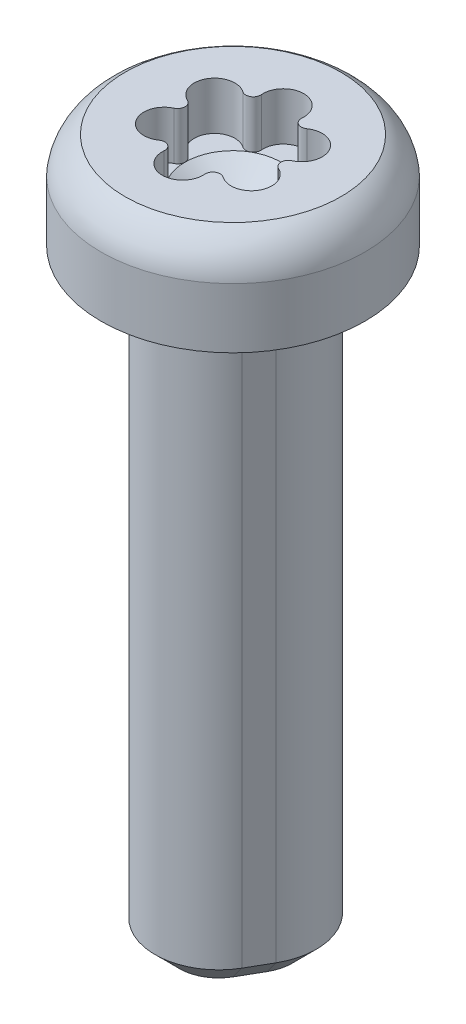
ISO-10303-21;
HEADER;
FILE_DESCRIPTION(('STEP AP214'),'2;1');
FILE_NAME('part.step','',(''),(''),'','','');
FILE_SCHEMA(('AUTOMOTIVE_DESIGN { 1 0 10303 214 1 1 1 1 }'));
ENDSEC;
DATA;
#1=APPLICATION_CONTEXT('core data for automotive mechanical design processes');
#2=APPLICATION_PROTOCOL_DEFINITION('international standard','automotive_design',2000,#1);
#3=PRODUCT_CONTEXT('',#1,'mechanical');
#4=PRODUCT('Part','Part','',(#3));
#5=PRODUCT_RELATED_PRODUCT_CATEGORY('part','',(#4));
#6=PRODUCT_DEFINITION_FORMATION('','',#4);
#7=PRODUCT_DEFINITION_CONTEXT('part definition',#1,'design');
#8=PRODUCT_DEFINITION('design','',#6,#7);
#9=PRODUCT_DEFINITION_SHAPE('','',#8);
#10=(LENGTH_UNIT() NAMED_UNIT(*) SI_UNIT(.MILLI.,.METRE.));
#11=(NAMED_UNIT(*) PLANE_ANGLE_UNIT() SI_UNIT($,.RADIAN.));
#12=(NAMED_UNIT(*) SI_UNIT($,.STERADIAN.) SOLID_ANGLE_UNIT());
#13=UNCERTAINTY_MEASURE_WITH_UNIT(LENGTH_MEASURE(1.E-05),#10,'distance_accuracy_value','');
#14=(GEOMETRIC_REPRESENTATION_CONTEXT(3) GLOBAL_UNCERTAINTY_ASSIGNED_CONTEXT((#13)) GLOBAL_UNIT_ASSIGNED_CONTEXT((#10,
#11,#12)) REPRESENTATION_CONTEXT('',''));
#15=CARTESIAN_POINT('',(0.,0.,0.));
#16=DIRECTION('',(0.,0.,1.));
#17=DIRECTION('',(1.,0.,0.));
#18=AXIS2_PLACEMENT_3D('',#15,#16,#17);
#19=CARTESIAN_POINT('',(0.,0.,0.));
#20=DIRECTION('',(0.,1.,0.));
#21=DIRECTION('',(0.,0.,1.));
#22=AXIS2_PLACEMENT_3D('',#19,#20,#21);
#23=CONICAL_SURFACE('',#22,0.507999999967979,1.02974425862593);
#24=CARTESIAN_POINT('',(0.,-0.305237194481833,0.));
#25=VERTEX_POINT('',#24);
#26=VERTEX_LOOP('',#25);
#27=FACE_BOUND('',#26,.T.);
#28=CARTESIAN_POINT('',(0.,0.,0.));
#29=DIRECTION('',(0.,1.,0.));
#30=DIRECTION('',(0.,0.,1.));
#31=AXIS2_PLACEMENT_3D('',#28,#29,#30);
#32=CIRCLE('',#31,0.507999999967979);
#33=CARTESIAN_POINT('',(0.507999999983995,0.,0.));
#34=VERTEX_POINT('',#33);
#35=CARTESIAN_POINT('',(0.253999999991877,0.,0.439940905108728));
#36=VERTEX_POINT('',#35);
#37=EDGE_CURVE('E201',#34,#36,#32,.F.);
#38=ORIENTED_EDGE('',*,*,#37,.F.);
#39=CARTESIAN_POINT('',(0.,0.,0.));
#40=DIRECTION('',(0.,1.,0.));
#41=DIRECTION('',(0.,0.,1.));
#42=AXIS2_PLACEMENT_3D('',#39,#40,#41);
#43=CIRCLE('',#42,0.507999999967979);
#44=CARTESIAN_POINT('',(0.253999999992017,0.,-0.439940905108593));
#45=VERTEX_POINT('',#44);
#46=EDGE_CURVE('E227',#45,#34,#43,.F.);
#47=ORIENTED_EDGE('',*,*,#46,.F.);
#48=CARTESIAN_POINT('',(0.,0.,0.));
#49=DIRECTION('',(0.,1.,0.));
#50=DIRECTION('',(0.,0.,1.));
#51=AXIS2_PLACEMENT_3D('',#48,#49,#50);
#52=CIRCLE('',#51,0.507999999967979);
#53=CARTESIAN_POINT('',(-0.253999999991996,0.,-0.439940905108543));
#54=VERTEX_POINT('',#53);
#55=EDGE_CURVE('E224',#54,#45,#52,.F.);
#56=ORIENTED_EDGE('',*,*,#55,.F.);
#57=CARTESIAN_POINT('',(0.,0.,0.));
#58=DIRECTION('',(0.,1.,0.));
#59=DIRECTION('',(0.,0.,1.));
#60=AXIS2_PLACEMENT_3D('',#57,#58,#59);
#61=CIRCLE('',#60,0.507999999967979);
#62=CARTESIAN_POINT('',(-0.507999999983968,0.,1.08311057522258E-13));
#63=VERTEX_POINT('',#62);
#64=EDGE_CURVE('E178',#63,#54,#61,.F.);
#65=ORIENTED_EDGE('',*,*,#64,.F.);
#66=CARTESIAN_POINT('',(0.,0.,0.));
#67=DIRECTION('',(0.,1.,0.));
#68=DIRECTION('',(0.,0.,1.));
#69=AXIS2_PLACEMENT_3D('',#66,#67,#68);
#70=CIRCLE('',#69,0.507999999967979);
#71=CARTESIAN_POINT('',(-0.253999999992049,0.,0.439940905108703));
#72=VERTEX_POINT('',#71);
#73=EDGE_CURVE('E20',#72,#63,#70,.F.);
#74=ORIENTED_EDGE('',*,*,#73,.F.);
#75=CARTESIAN_POINT('',(0.,0.,0.));
#76=DIRECTION('',(0.,1.,0.));
#77=DIRECTION('',(0.,0.,1.));
#78=AXIS2_PLACEMENT_3D('',#75,#76,#77);
#79=CIRCLE('',#78,0.507999999967979);
#80=EDGE_CURVE('E175',#36,#72,#79,.F.);
#81=ORIENTED_EDGE('',*,*,#80,.F.);
#82=EDGE_LOOP('',(#38,#47,#56,#65,#74,#81));
#83=FACE_BOUND('',#82,.T.);
#84=ADVANCED_FACE('F17',(#27,#83),#23,.F.);
#85=CARTESIAN_POINT('',(-0.146605300490876,0.,-0.52062782910893));
#86=DIRECTION('',(0.,1.,0.));
#87=DIRECTION('',(-1.,0.,0.));
#88=AXIS2_PLACEMENT_3D('',#85,#86,#87);
#89=PLANE('',#88);
#90=CARTESIAN_POINT('',(-0.461937950378704,0.,0.266700000000165));
#91=DIRECTION('',(0.,1.,0.));
#92=DIRECTION('',(0.,0.,1.));
#93=AXIS2_PLACEMENT_3D('',#90,#91,#92);
#94=CIRCLE('',#93,0.215900000000007);
#95=CARTESIAN_POINT('',(-0.553252928157463,0.,0.0710615967321891));
#96=VERTEX_POINT('',#95);
#97=CARTESIAN_POINT('',(-0.33816761208222,0.,0.443600292136642));
#98=VERTEX_POINT('',#97);
#99=EDGE_CURVE('E186',#96,#98,#94,.T.);
#100=ORIENTED_EDGE('',*,*,#99,.T.);
#101=CARTESIAN_POINT('',(-0.293210600981711,0.,0.50785565821811));
#102=DIRECTION('',(0.,1.,0.));
#103=DIRECTION('',(0.,0.,1.));
#104=AXIS2_PLACEMENT_3D('',#101,#102,#103);
#105=CIRCLE('',#104,0.0784212019632242);
#106=EDGE_CURVE('E184',#72,#98,#105,.T.);
#107=ORIENTED_EDGE('',*,*,#106,.F.);
#108=ORIENTED_EDGE('',*,*,#73,.T.);
#109=CARTESIAN_POINT('',(-0.586421201963182,0.,2.22044604925031E-13));
#110=DIRECTION('',(0.,1.,0.));
#111=DIRECTION('',(0.,0.,1.));
#112=AXIS2_PLACEMENT_3D('',#109,#110,#111);
#113=CIRCLE('',#112,0.0784212019632242);
#114=EDGE_CURVE('E215',#96,#63,#113,.T.);
#115=ORIENTED_EDGE('',*,*,#114,.F.);
#116=EDGE_LOOP('',(#100,#107,#108,#115));
#117=FACE_BOUND('',#116,.T.);
#118=ADVANCED_FACE('F185',(#117),#89,.T.);
#119=CARTESIAN_POINT('',(-0.146605300490876,0.,-0.52062782910893));
#120=DIRECTION('',(0.,1.,0.));
#121=DIRECTION('',(-1.,0.,0.));
#122=AXIS2_PLACEMENT_3D('',#119,#120,#121);
#123=PLANE('',#122);
#124=CARTESIAN_POINT('',(0.,0.,0.533400000000177));
#125=DIRECTION('',(0.,1.,0.));
#126=DIRECTION('',(-1.,0.,0.));
#127=AXIS2_PLACEMENT_3D('',#124,#125,#126);
#128=CIRCLE('',#127,0.215900000000007);
#129=CARTESIAN_POINT('',(-0.215085316075394,0.,0.514661888868638));
#130=VERTEX_POINT('',#129);
#131=CARTESIAN_POINT('',(0.21508531607525,0.,0.514661888868641));
#132=VERTEX_POINT('',#131);
#133=EDGE_CURVE('E207',#130,#132,#128,.T.);
#134=ORIENTED_EDGE('',*,*,#133,.T.);
#135=CARTESIAN_POINT('',(0.293210600981489,0.,0.507855658218089));
#136=DIRECTION('',(0.,1.,0.));
#137=DIRECTION('',(0.,0.,1.));
#138=AXIS2_PLACEMENT_3D('',#135,#136,#137);
#139=CIRCLE('',#138,0.0784212019632243);
#140=EDGE_CURVE('E199',#36,#132,#139,.T.);
#141=ORIENTED_EDGE('',*,*,#140,.F.);
#142=ORIENTED_EDGE('',*,*,#80,.T.);
#143=CARTESIAN_POINT('',(-0.293210600981711,0.,0.50785565821811));
#144=DIRECTION('',(0.,1.,0.));
#145=DIRECTION('',(0.,0.,1.));
#146=AXIS2_PLACEMENT_3D('',#143,#144,#145);
#147=CIRCLE('',#146,0.0784212019632242);
#148=EDGE_CURVE('E197',#130,#72,#147,.T.);
#149=ORIENTED_EDGE('',*,*,#148,.F.);
#150=EDGE_LOOP('',(#134,#141,#142,#149));
#151=FACE_BOUND('',#150,.T.);
#152=ADVANCED_FACE('F196',(#151),#123,.T.);
#153=CARTESIAN_POINT('',(-0.146605300490876,0.,-0.52062782910893));
#154=DIRECTION('',(0.,1.,0.));
#155=DIRECTION('',(-1.,0.,0.));
#156=AXIS2_PLACEMENT_3D('',#153,#154,#155);
#157=PLANE('',#156);
#158=CARTESIAN_POINT('',(0.461937950378518,0.,0.26670000000005));
#159=DIRECTION('',(0.,1.,0.));
#160=DIRECTION('',(0.,0.,1.));
#161=AXIS2_PLACEMENT_3D('',#158,#159,#160);
#162=CIRCLE('',#161,0.215900000000006);
#163=CARTESIAN_POINT('',(0.33816761208205,0.,0.443600292136598));
#164=VERTEX_POINT('',#163);
#165=CARTESIAN_POINT('',(0.553252928157493,0.,0.0710615967320709));
#166=VERTEX_POINT('',#165);
#167=EDGE_CURVE('E246',#164,#166,#162,.T.);
#168=ORIENTED_EDGE('',*,*,#167,.T.);
#169=CARTESIAN_POINT('',(0.586421201963236,0.,0.));
#170=DIRECTION('',(0.,1.,0.));
#171=DIRECTION('',(0.,0.,1.));
#172=AXIS2_PLACEMENT_3D('',#169,#170,#171);
#173=CIRCLE('',#172,0.0784212019632242);
#174=EDGE_CURVE('E237',#34,#166,#173,.T.);
#175=ORIENTED_EDGE('',*,*,#174,.F.);
#176=ORIENTED_EDGE('',*,*,#37,.T.);
#177=CARTESIAN_POINT('',(0.293210600981489,0.,0.507855658218089));
#178=DIRECTION('',(0.,1.,0.));
#179=DIRECTION('',(0.,0.,1.));
#180=AXIS2_PLACEMENT_3D('',#177,#178,#179);
#181=CIRCLE('',#180,0.0784212019632243);
#182=EDGE_CURVE('E234',#164,#36,#181,.T.);
#183=ORIENTED_EDGE('',*,*,#182,.F.);
#184=EDGE_LOOP('',(#168,#175,#176,#183));
#185=FACE_BOUND('',#184,.T.);
#186=ADVANCED_FACE('F233',(#185),#157,.T.);
#187=CARTESIAN_POINT('',(-0.146605300490876,0.,-0.52062782910893));
#188=DIRECTION('',(0.,1.,0.));
#189=DIRECTION('',(-1.,0.,0.));
#190=AXIS2_PLACEMENT_3D('',#187,#188,#189);
#191=PLANE('',#190);
#192=CARTESIAN_POINT('',(0.461937950378539,0.,-0.266699999999908));
#193=DIRECTION('',(0.,1.,0.));
#194=DIRECTION('',(0.,0.,1.));
#195=AXIS2_PLACEMENT_3D('',#192,#193,#194);
#196=CIRCLE('',#195,0.215900000000006);
#197=CARTESIAN_POINT('',(0.553252928157469,0.,-0.0710615967319732));
#198=VERTEX_POINT('',#197);
#199=CARTESIAN_POINT('',(0.338167612082123,0.,-0.443600292136439));
#200=VERTEX_POINT('',#199);
#201=EDGE_CURVE('E257',#198,#200,#196,.T.);
#202=ORIENTED_EDGE('',*,*,#201,.T.);
#203=CARTESIAN_POINT('',(0.293210600981603,0.,-0.507855658217916));
#204=DIRECTION('',(0.,1.,0.));
#205=DIRECTION('',(0.,0.,1.));
#206=AXIS2_PLACEMENT_3D('',#203,#204,#205);
#207=CIRCLE('',#206,0.0784212019632243);
#208=EDGE_CURVE('E259',#45,#200,#207,.T.);
#209=ORIENTED_EDGE('',*,*,#208,.F.);
#210=ORIENTED_EDGE('',*,*,#46,.T.);
#211=CARTESIAN_POINT('',(0.586421201963236,0.,0.));
#212=DIRECTION('',(0.,1.,0.));
#213=DIRECTION('',(0.,0.,1.));
#214=AXIS2_PLACEMENT_3D('',#211,#212,#213);
#215=CIRCLE('',#214,0.0784212019632242);
#216=EDGE_CURVE('E253',#198,#34,#215,.T.);
#217=ORIENTED_EDGE('',*,*,#216,.F.);
#218=EDGE_LOOP('',(#202,#209,#210,#217));
#219=FACE_BOUND('',#218,.T.);
#220=ADVANCED_FACE('F477',(#219),#191,.T.);
#221=CARTESIAN_POINT('',(-0.146605300490876,0.,-0.52062782910893));
#222=DIRECTION('',(0.,1.,0.));
#223=DIRECTION('',(-1.,0.,0.));
#224=AXIS2_PLACEMENT_3D('',#221,#222,#223);
#225=PLANE('',#224);
#226=CARTESIAN_POINT('',(0.,0.,-0.533399999999941));
#227=DIRECTION('',(0.,1.,0.));
#228=DIRECTION('',(-1.,0.,0.));
#229=AXIS2_PLACEMENT_3D('',#226,#227,#228);
#230=CIRCLE('',#229,0.215900000000006);
#231=CARTESIAN_POINT('',(0.21508531607531,0.,-0.514661888868433));
#232=VERTEX_POINT('',#231);
#233=CARTESIAN_POINT('',(-0.215085316075306,0.,-0.514661888868366));
#234=VERTEX_POINT('',#233);
#235=EDGE_CURVE('E266',#232,#234,#230,.T.);
#236=ORIENTED_EDGE('',*,*,#235,.T.);
#237=CARTESIAN_POINT('',(-0.293210600981544,0.,-0.507855658217826));
#238=DIRECTION('',(0.,1.,0.));
#239=DIRECTION('',(0.,0.,1.));
#240=AXIS2_PLACEMENT_3D('',#237,#238,#239);
#241=CIRCLE('',#240,0.0784212019632243);
#242=EDGE_CURVE('E268',#54,#234,#241,.T.);
#243=ORIENTED_EDGE('',*,*,#242,.F.);
#244=ORIENTED_EDGE('',*,*,#55,.T.);
#245=CARTESIAN_POINT('',(0.293210600981603,0.,-0.507855658217916));
#246=DIRECTION('',(0.,1.,0.));
#247=DIRECTION('',(0.,0.,1.));
#248=AXIS2_PLACEMENT_3D('',#245,#246,#247);
#249=CIRCLE('',#248,0.0784212019632243);
#250=EDGE_CURVE('E263',#232,#45,#249,.T.);
#251=ORIENTED_EDGE('',*,*,#250,.F.);
#252=EDGE_LOOP('',(#236,#243,#244,#251));
#253=FACE_BOUND('',#252,.T.);
#254=ADVANCED_FACE('F473',(#253),#225,.T.);
#255=CARTESIAN_POINT('',(-0.146605300490876,0.,-0.52062782910893));
#256=DIRECTION('',(0.,1.,0.));
#257=DIRECTION('',(-1.,0.,0.));
#258=AXIS2_PLACEMENT_3D('',#255,#256,#257);
#259=PLANE('',#258);
#260=CARTESIAN_POINT('',(-0.461937950378664,0.,-0.266700000000002));
#261=DIRECTION('',(0.,1.,0.));
#262=DIRECTION('',(0.,0.,1.));
#263=AXIS2_PLACEMENT_3D('',#260,#261,#262);
#264=CIRCLE('',#263,0.215900000000007);
#265=CARTESIAN_POINT('',(-0.338167612082117,0.,-0.443600292136418));
#266=VERTEX_POINT('',#265);
#267=CARTESIAN_POINT('',(-0.553252928157442,0.,-0.0710615967318853));
#268=VERTEX_POINT('',#267);
#269=EDGE_CURVE('E221',#266,#268,#264,.T.);
#270=ORIENTED_EDGE('',*,*,#269,.T.);
#271=CARTESIAN_POINT('',(-0.586421201963182,0.,2.22044604925031E-13));
#272=DIRECTION('',(0.,1.,0.));
#273=DIRECTION('',(0.,0.,1.));
#274=AXIS2_PLACEMENT_3D('',#271,#272,#273);
#275=CIRCLE('',#274,0.0784212019632242);
#276=EDGE_CURVE('E218',#63,#268,#275,.T.);
#277=ORIENTED_EDGE('',*,*,#276,.F.);
#278=ORIENTED_EDGE('',*,*,#64,.T.);
#279=CARTESIAN_POINT('',(-0.293210600981544,0.,-0.507855658217826));
#280=DIRECTION('',(0.,1.,0.));
#281=DIRECTION('',(0.,0.,1.));
#282=AXIS2_PLACEMENT_3D('',#279,#280,#281);
#283=CIRCLE('',#282,0.0784212019632243);
#284=EDGE_CURVE('E272',#266,#54,#283,.T.);
#285=ORIENTED_EDGE('',*,*,#284,.F.);
#286=EDGE_LOOP('',(#270,#277,#278,#285));
#287=FACE_BOUND('',#286,.T.);
#288=ADVANCED_FACE('F469',(#287),#259,.T.);
#289=CARTESIAN_POINT('',(-0.461937950378664,0.,-0.266700000000002));
#290=DIRECTION('',(0.,1.,0.));
#291=DIRECTION('',(0.,0.,1.));
#292=AXIS2_PLACEMENT_3D('',#289,#290,#291);
#293=CYLINDRICAL_SURFACE('',#292,0.215900000000007);
#294=ORIENTED_EDGE('',*,*,#269,.F.);
#295=DIRECTION('',(0.,1.,0.));
#296=VECTOR('',#295,1.);
#297=CARTESIAN_POINT('',(-0.338167612082152,0.,-0.443600292136411));
#298=LINE('',#297,#296);
#299=CARTESIAN_POINT('',(-0.338167612082132,0.508000000000004,-0.443600292136397));
#300=VERTEX_POINT('',#299);
#301=EDGE_CURVE('E276',#300,#266,#298,.F.);
#302=ORIENTED_EDGE('',*,*,#301,.F.);
#303=CARTESIAN_POINT('',(-0.461937950378664,0.507999999999998,-0.266700000000002));
#304=DIRECTION('',(0.,1.,0.));
#305=DIRECTION('',(0.,0.,1.));
#306=AXIS2_PLACEMENT_3D('',#303,#304,#305);
#307=CIRCLE('',#306,0.215900000000007);
#308=CARTESIAN_POINT('',(-0.553252928157442,0.507999999999998,-0.0710615967318855));
#309=VERTEX_POINT('',#308);
#310=EDGE_CURVE('E275',#300,#309,#307,.T.);
#311=ORIENTED_EDGE('',*,*,#310,.T.);
#312=DIRECTION('',(0.,1.,0.));
#313=VECTOR('',#312,1.);
#314=CARTESIAN_POINT('',(-0.553252928157483,0.,-0.0710615967318169));
#315=LINE('',#314,#313);
#316=EDGE_CURVE('E217',#268,#309,#315,.T.);
#317=ORIENTED_EDGE('',*,*,#316,.F.);
#318=EDGE_LOOP('',(#294,#302,#311,#317));
#319=FACE_BOUND('',#318,.T.);
#320=ADVANCED_FACE('F465',(#319),#293,.F.);
#321=CARTESIAN_POINT('',(-0.586421201963182,0.,2.22044604925031E-13));
#322=DIRECTION('',(0.,1.,0.));
#323=DIRECTION('',(0.,0.,1.));
#324=AXIS2_PLACEMENT_3D('',#321,#322,#323);
#325=CYLINDRICAL_SURFACE('',#324,0.0784212019632242);
#326=DIRECTION('',(0.,1.,0.));
#327=VECTOR('',#326,1.);
#328=CARTESIAN_POINT('',(-0.553252928157476,0.,0.0710615967321329));
#329=LINE('',#328,#327);
#330=CARTESIAN_POINT('',(-0.553252928157463,0.508000000000014,0.071061596732189));
#331=VERTEX_POINT('',#330);
#332=EDGE_CURVE('E214',#331,#96,#329,.F.);
#333=ORIENTED_EDGE('',*,*,#332,.T.);
#334=ORIENTED_EDGE('',*,*,#114,.T.);
#335=ORIENTED_EDGE('',*,*,#276,.T.);
#336=ORIENTED_EDGE('',*,*,#316,.T.);
#337=CARTESIAN_POINT('',(-0.586421201963183,0.507999999999998,2.21891545282408E-13));
#338=DIRECTION('',(0.,1.,0.));
#339=DIRECTION('',(0.,0.,1.));
#340=AXIS2_PLACEMENT_3D('',#337,#338,#339);
#341=CIRCLE('',#340,0.0784212019632242);
#342=EDGE_CURVE('E278',#309,#331,#341,.F.);
#343=ORIENTED_EDGE('',*,*,#342,.T.);
#344=EDGE_LOOP('',(#333,#334,#335,#336,#343));
#345=FACE_BOUND('',#344,.T.);
#346=ADVANCED_FACE('F461',(#345),#325,.T.);
#347=CARTESIAN_POINT('',(-0.461937950378704,0.,0.266700000000165));
#348=DIRECTION('',(0.,1.,0.));
#349=DIRECTION('',(0.,0.,1.));
#350=AXIS2_PLACEMENT_3D('',#347,#348,#349);
#351=CYLINDRICAL_SURFACE('',#350,0.215900000000007);
#352=ORIENTED_EDGE('',*,*,#99,.F.);
#353=ORIENTED_EDGE('',*,*,#332,.F.);
#354=CARTESIAN_POINT('',(-0.461937950378704,0.508000000000003,0.266700000000165));
#355=DIRECTION('',(0.,1.,0.));
#356=DIRECTION('',(0.,0.,1.));
#357=AXIS2_PLACEMENT_3D('',#354,#355,#356);
#358=CIRCLE('',#357,0.215900000000007);
#359=CARTESIAN_POINT('',(-0.33816761208222,0.508000000000003,0.443600292136642));
#360=VERTEX_POINT('',#359);
#361=EDGE_CURVE('E281',#331,#360,#358,.T.);
#362=ORIENTED_EDGE('',*,*,#361,.T.);
#363=DIRECTION('',(0.,1.,0.));
#364=VECTOR('',#363,1.);
#365=CARTESIAN_POINT('',(-0.338167612082214,0.,0.443600292136622));
#366=LINE('',#365,#364);
#367=EDGE_CURVE('E191',#98,#360,#366,.T.);
#368=ORIENTED_EDGE('',*,*,#367,.F.);
#369=EDGE_LOOP('',(#352,#353,#362,#368));
#370=FACE_BOUND('',#369,.T.);
#371=ADVANCED_FACE('F458',(#370),#351,.F.);
#372=CARTESIAN_POINT('',(-0.293210600981711,0.,0.50785565821811));
#373=DIRECTION('',(0.,1.,0.));
#374=DIRECTION('',(0.,0.,1.));
#375=AXIS2_PLACEMENT_3D('',#372,#373,#374);
#376=CYLINDRICAL_SURFACE('',#375,0.0784212019632242);
#377=DIRECTION('',(0.,1.,0.));
#378=VECTOR('',#377,1.);
#379=CARTESIAN_POINT('',(-0.215085316075363,0.,0.514661888868617));
#380=LINE('',#379,#378);
#381=CARTESIAN_POINT('',(-0.215085316075394,0.508000000000014,0.514661888868638));
#382=VERTEX_POINT('',#381);
#383=EDGE_CURVE('E205',#382,#130,#380,.F.);
#384=ORIENTED_EDGE('',*,*,#383,.T.);
#385=ORIENTED_EDGE('',*,*,#148,.T.);
#386=ORIENTED_EDGE('',*,*,#106,.T.);
#387=ORIENTED_EDGE('',*,*,#367,.T.);
#388=CARTESIAN_POINT('',(-0.293210600981711,0.508000000000003,0.50785565821811));
#389=DIRECTION('',(0.,1.,0.));
#390=DIRECTION('',(0.,0.,1.));
#391=AXIS2_PLACEMENT_3D('',#388,#389,#390);
#392=CIRCLE('',#391,0.0784212019632242);
#393=EDGE_CURVE('E283',#360,#382,#392,.F.);
#394=ORIENTED_EDGE('',*,*,#393,.T.);
#395=EDGE_LOOP('',(#384,#385,#386,#387,#394));
#396=FACE_BOUND('',#395,.T.);
#397=ADVANCED_FACE('F202',(#396),#376,.T.);
#398=CARTESIAN_POINT('',(0.,0.,0.533400000000177));
#399=DIRECTION('',(0.,1.,0.));
#400=DIRECTION('',(0.,0.,1.));
#401=AXIS2_PLACEMENT_3D('',#398,#399,#400);
#402=CYLINDRICAL_SURFACE('',#401,0.215900000000007);
#403=ORIENTED_EDGE('',*,*,#133,.F.);
#404=ORIENTED_EDGE('',*,*,#383,.F.);
#405=CARTESIAN_POINT('',(0.,0.507999999999995,0.533400000000177));
#406=DIRECTION('',(0.,1.,0.));
#407=DIRECTION('',(0.,0.,1.));
#408=AXIS2_PLACEMENT_3D('',#405,#406,#407);
#409=CIRCLE('',#408,0.215900000000007);
#410=CARTESIAN_POINT('',(0.21508531607525,0.507999999999995,0.514661888868641));
#411=VERTEX_POINT('',#410);
#412=EDGE_CURVE('E285',#382,#411,#409,.T.);
#413=ORIENTED_EDGE('',*,*,#412,.T.);
#414=DIRECTION('',(0.,1.,0.));
#415=VECTOR('',#414,1.);
#416=CARTESIAN_POINT('',(0.215085316075203,0.,0.514661888868642));
#417=LINE('',#416,#415);
#418=EDGE_CURVE('E248',#132,#411,#417,.T.);
#419=ORIENTED_EDGE('',*,*,#418,.F.);
#420=EDGE_LOOP('',(#403,#404,#413,#419));
#421=FACE_BOUND('',#420,.T.);
#422=ADVANCED_FACE('F452',(#421),#402,.F.);
#423=CARTESIAN_POINT('',(0.293210600981489,0.,0.507855658218089));
#424=DIRECTION('',(0.,1.,0.));
#425=DIRECTION('',(0.,0.,1.));
#426=AXIS2_PLACEMENT_3D('',#423,#424,#425);
#427=CYLINDRICAL_SURFACE('',#426,0.0784212019632243);
#428=DIRECTION('',(0.,1.,0.));
#429=VECTOR('',#428,1.);
#430=CARTESIAN_POINT('',(0.338167612082086,0.,0.44360029213658));
#431=LINE('',#430,#429);
#432=CARTESIAN_POINT('',(0.33816761208205,0.50799999999999,0.443600292136598));
#433=VERTEX_POINT('',#432);
#434=EDGE_CURVE('E243',#433,#164,#431,.F.);
#435=ORIENTED_EDGE('',*,*,#434,.T.);
#436=ORIENTED_EDGE('',*,*,#182,.T.);
#437=ORIENTED_EDGE('',*,*,#140,.T.);
#438=ORIENTED_EDGE('',*,*,#418,.T.);
#439=CARTESIAN_POINT('',(0.293210600981489,0.507999999999978,0.507855658218089));
#440=DIRECTION('',(0.,1.,0.));
#441=DIRECTION('',(0.,0.,1.));
#442=AXIS2_PLACEMENT_3D('',#439,#440,#441);
#443=CIRCLE('',#442,0.0784212019632243);
#444=EDGE_CURVE('E288',#411,#433,#443,.F.);
#445=ORIENTED_EDGE('',*,*,#444,.T.);
#446=EDGE_LOOP('',(#435,#436,#437,#438,#445));
#447=FACE_BOUND('',#446,.T.);
#448=ADVANCED_FACE('F240',(#447),#427,.T.);
#449=CARTESIAN_POINT('',(0.461937950378518,0.,0.26670000000005));
#450=DIRECTION('',(0.,1.,0.));
#451=DIRECTION('',(0.,0.,1.));
#452=AXIS2_PLACEMENT_3D('',#449,#450,#451);
#453=CYLINDRICAL_SURFACE('',#452,0.215900000000006);
#454=DIRECTION('',(0.,1.,0.));
#455=VECTOR('',#454,1.);
#456=CARTESIAN_POINT('',(0.553252928157557,0.,0.071061596732059));
#457=LINE('',#456,#455);
#458=CARTESIAN_POINT('',(0.553252928157492,0.507999999999997,0.0710615967320707));
#459=VERTEX_POINT('',#458);
#460=EDGE_CURVE('E252',#166,#459,#457,.T.);
#461=ORIENTED_EDGE('',*,*,#460,.F.);
#462=ORIENTED_EDGE('',*,*,#167,.F.);
#463=ORIENTED_EDGE('',*,*,#434,.F.);
#464=CARTESIAN_POINT('',(0.461937950378518,0.507999999999997,0.26670000000005));
#465=DIRECTION('',(0.,1.,0.));
#466=DIRECTION('',(0.,0.,1.));
#467=AXIS2_PLACEMENT_3D('',#464,#465,#466);
#468=CIRCLE('',#467,0.215900000000006);
#469=EDGE_CURVE('E290',#433,#459,#468,.T.);
#470=ORIENTED_EDGE('',*,*,#469,.T.);
#471=EDGE_LOOP('',(#461,#462,#463,#470));
#472=FACE_BOUND('',#471,.T.);
#473=ADVANCED_FACE('F445',(#472),#453,.F.);
#474=CARTESIAN_POINT('',(0.586421201963236,0.,0.));
#475=DIRECTION('',(0.,1.,0.));
#476=DIRECTION('',(0.,0.,1.));
#477=AXIS2_PLACEMENT_3D('',#474,#475,#476);
#478=CYLINDRICAL_SURFACE('',#477,0.0784212019632242);
#479=CARTESIAN_POINT('',(0.586421201963236,0.508000000000011,0.));
#480=DIRECTION('',(0.,1.,0.));
#481=DIRECTION('',(0.,0.,1.));
#482=AXIS2_PLACEMENT_3D('',#479,#480,#481);
#483=CIRCLE('',#482,0.0784212019632242);
#484=CARTESIAN_POINT('',(0.553252928157469,0.508000000000011,-0.0710615967319734));
#485=VERTEX_POINT('',#484);
#486=EDGE_CURVE('E293',#459,#485,#483,.F.);
#487=ORIENTED_EDGE('',*,*,#486,.T.);
#488=DIRECTION('',(0.,1.,0.));
#489=VECTOR('',#488,1.);
#490=CARTESIAN_POINT('',(0.553252928157485,0.,-0.0710615967319571));
#491=LINE('',#490,#489);
#492=EDGE_CURVE('E256',#485,#198,#491,.F.);
#493=ORIENTED_EDGE('',*,*,#492,.T.);
#494=ORIENTED_EDGE('',*,*,#216,.T.);
#495=ORIENTED_EDGE('',*,*,#174,.T.);
#496=ORIENTED_EDGE('',*,*,#460,.T.);
#497=EDGE_LOOP('',(#487,#493,#494,#495,#496));
#498=FACE_BOUND('',#497,.T.);
#499=ADVANCED_FACE('F441',(#498),#478,.T.);
#500=CARTESIAN_POINT('',(0.461937950378539,0.,-0.266699999999908));
#501=DIRECTION('',(0.,1.,0.));
#502=DIRECTION('',(0.,0.,1.));
#503=AXIS2_PLACEMENT_3D('',#500,#501,#502);
#504=CYLINDRICAL_SURFACE('',#503,0.215900000000006);
#505=DIRECTION('',(0.,1.,0.));
#506=VECTOR('',#505,1.);
#507=CARTESIAN_POINT('',(0.338167612082123,0.,-0.443600292136439));
#508=LINE('',#507,#506);
#509=CARTESIAN_POINT('',(0.338167612082117,0.508000000000011,-0.44360029213644));
#510=VERTEX_POINT('',#509);
#511=EDGE_CURVE('E262',#200,#510,#508,.T.);
#512=ORIENTED_EDGE('',*,*,#511,.F.);
#513=ORIENTED_EDGE('',*,*,#201,.F.);
#514=ORIENTED_EDGE('',*,*,#492,.F.);
#515=CARTESIAN_POINT('',(0.461937950378539,0.508000000000011,-0.266699999999908));
#516=DIRECTION('',(0.,1.,0.));
#517=DIRECTION('',(0.,0.,1.));
#518=AXIS2_PLACEMENT_3D('',#515,#516,#517);
#519=CIRCLE('',#518,0.215900000000006);
#520=EDGE_CURVE('E295',#485,#510,#519,.T.);
#521=ORIENTED_EDGE('',*,*,#520,.T.);
#522=EDGE_LOOP('',(#512,#513,#514,#521));
#523=FACE_BOUND('',#522,.T.);
#524=ADVANCED_FACE('F437',(#523),#504,.F.);
#525=CARTESIAN_POINT('',(0.293210600981603,0.,-0.507855658217916));
#526=DIRECTION('',(0.,1.,0.));
#527=DIRECTION('',(0.,0.,1.));
#528=AXIS2_PLACEMENT_3D('',#525,#526,#527);
#529=CYLINDRICAL_SURFACE('',#528,0.0784212019632243);
#530=CARTESIAN_POINT('',(0.293210600981603,0.508000000000017,-0.507855658217916));
#531=DIRECTION('',(0.,1.,0.));
#532=DIRECTION('',(0.,0.,1.));
#533=AXIS2_PLACEMENT_3D('',#530,#531,#532);
#534=CIRCLE('',#533,0.0784212019632243);
#535=CARTESIAN_POINT('',(0.21508531607531,0.508000000000004,-0.514661888868433));
#536=VERTEX_POINT('',#535);
#537=EDGE_CURVE('E298',#510,#536,#534,.F.);
#538=ORIENTED_EDGE('',*,*,#537,.T.);
#539=DIRECTION('',(0.,1.,0.));
#540=VECTOR('',#539,1.);
#541=CARTESIAN_POINT('',(0.215085316075304,0.,-0.514661888868411));
#542=LINE('',#541,#540);
#543=EDGE_CURVE('E265',#536,#232,#542,.F.);
#544=ORIENTED_EDGE('',*,*,#543,.T.);
#545=ORIENTED_EDGE('',*,*,#250,.T.);
#546=ORIENTED_EDGE('',*,*,#208,.T.);
#547=ORIENTED_EDGE('',*,*,#511,.T.);
#548=EDGE_LOOP('',(#538,#544,#545,#546,#547));
#549=FACE_BOUND('',#548,.T.);
#550=ADVANCED_FACE('F433',(#549),#529,.T.);
#551=CARTESIAN_POINT('',(0.,0.,-0.533399999999941));
#552=DIRECTION('',(0.,1.,0.));
#553=DIRECTION('',(0.,0.,1.));
#554=AXIS2_PLACEMENT_3D('',#551,#552,#553);
#555=CYLINDRICAL_SURFACE('',#554,0.215900000000006);
#556=ORIENTED_EDGE('',*,*,#235,.F.);
#557=ORIENTED_EDGE('',*,*,#543,.F.);
#558=CARTESIAN_POINT('',(0.,0.508000000000015,-0.533399999999941));
#559=DIRECTION('',(0.,1.,0.));
#560=DIRECTION('',(0.,0.,1.));
#561=AXIS2_PLACEMENT_3D('',#558,#559,#560);
#562=CIRCLE('',#561,0.215900000000006);
#563=CARTESIAN_POINT('',(-0.215085316075307,0.508000000000015,-0.514661888868366));
#564=VERTEX_POINT('',#563);
#565=EDGE_CURVE('E301',#536,#564,#562,.T.);
#566=ORIENTED_EDGE('',*,*,#565,.T.);
#567=DIRECTION('',(0.,1.,0.));
#568=VECTOR('',#567,1.);
#569=CARTESIAN_POINT('',(-0.215085316075256,0.,-0.514661888868348));
#570=LINE('',#569,#568);
#571=EDGE_CURVE('E271',#234,#564,#570,.T.);
#572=ORIENTED_EDGE('',*,*,#571,.F.);
#573=EDGE_LOOP('',(#556,#557,#566,#572));
#574=FACE_BOUND('',#573,.T.);
#575=ADVANCED_FACE('F429',(#574),#555,.F.);
#576=CARTESIAN_POINT('',(-0.293210600981544,0.,-0.507855658217826));
#577=DIRECTION('',(0.,1.,0.));
#578=DIRECTION('',(0.,0.,1.));
#579=AXIS2_PLACEMENT_3D('',#576,#577,#578);
#580=CYLINDRICAL_SURFACE('',#579,0.0784212019632243);
#581=ORIENTED_EDGE('',*,*,#301,.T.);
#582=ORIENTED_EDGE('',*,*,#284,.T.);
#583=ORIENTED_EDGE('',*,*,#242,.T.);
#584=ORIENTED_EDGE('',*,*,#571,.T.);
#585=CARTESIAN_POINT('',(-0.293210600981545,0.508000000000015,-0.507855658217826));
#586=DIRECTION('',(0.,1.,0.));
#587=DIRECTION('',(0.,0.,1.));
#588=AXIS2_PLACEMENT_3D('',#585,#586,#587);
#589=CIRCLE('',#588,0.0784212019632243);
#590=EDGE_CURVE('E303',#564,#300,#589,.F.);
#591=ORIENTED_EDGE('',*,*,#590,.T.);
#592=EDGE_LOOP('',(#581,#582,#583,#584,#591));
#593=FACE_BOUND('',#592,.T.);
#594=ADVANCED_FACE('F425',(#593),#580,.T.);
#595=CARTESIAN_POINT('',(0.508000000000113,0.507999999999997,0.));
#596=DIRECTION('',(0.,-1.,0.));
#597=DIRECTION('',(1.,0.,0.));
#598=AXIS2_PLACEMENT_3D('',#595,#596,#597);
#599=PLANE('',#598);
#600=CARTESIAN_POINT('',(0.,0.507999999999997,0.));
#601=DIRECTION('',(0.,1.,0.));
#602=DIRECTION('',(0.,0.,1.));
#603=AXIS2_PLACEMENT_3D('',#600,#601,#602);
#604=CIRCLE('',#603,1.14300000000001);
#605=CARTESIAN_POINT('',(0.,0.507999999999997,1.14300000000006));
#606=VERTEX_POINT('',#605);
#607=EDGE_CURVE('E307',#606,#606,#604,.F.);
#608=ORIENTED_EDGE('',*,*,#607,.F.);
#609=EDGE_LOOP('',(#608));
#610=FACE_BOUND('',#609,.T.);
#611=ORIENTED_EDGE('',*,*,#565,.F.);
#612=ORIENTED_EDGE('',*,*,#537,.F.);
#613=ORIENTED_EDGE('',*,*,#520,.F.);
#614=ORIENTED_EDGE('',*,*,#486,.F.);
#615=ORIENTED_EDGE('',*,*,#469,.F.);
#616=ORIENTED_EDGE('',*,*,#444,.F.);
#617=ORIENTED_EDGE('',*,*,#412,.F.);
#618=ORIENTED_EDGE('',*,*,#393,.F.);
#619=ORIENTED_EDGE('',*,*,#361,.F.);
#620=ORIENTED_EDGE('',*,*,#342,.F.);
#621=ORIENTED_EDGE('',*,*,#310,.F.);
#622=ORIENTED_EDGE('',*,*,#590,.F.);
#623=EDGE_LOOP('',(#611,#612,#613,#614,#615,#616,#617,#618,#619,#620,#621,#622));
#624=FACE_BOUND('',#623,.T.);
#625=ADVANCED_FACE('F421',(#610,#624),#599,.F.);
#626=CARTESIAN_POINT('',(-0.58292169928734,-6.85799999999999,0.488950000000345));
#627=DIRECTION('',(0.866025403784465,0.,-0.499999999999954));
#628=DIRECTION('',(-0.499999999999954,0.,-0.866025403784465));
#629=AXIS2_PLACEMENT_3D('',#626,#627,#628);
#630=PLANE('',#629);
#631=DIRECTION('',(0.499999999999963,1.15006585642608E-13,0.86602540378446));
#632=VECTOR('',#631,1.);
#633=CARTESIAN_POINT('',(-0.714903970824029,-6.60399999999994,0.260350000000246));
#634=LINE('',#633,#632);
#635=CARTESIAN_POINT('',(-0.714903970823999,-6.60399999999998,0.260350000000229));
#636=VERTEX_POINT('',#635);
#637=CARTESIAN_POINT('',(-0.582921699284634,-6.60399999999538,0.488949999987108));
#638=VERTEX_POINT('',#637);
#639=EDGE_CURVE('E358',#636,#638,#634,.T.);
#640=ORIENTED_EDGE('',*,*,#639,.T.);
#641=DIRECTION('',(0.,1.,0.));
#642=VECTOR('',#641,1.);
#643=CARTESIAN_POINT('',(-0.582921699287353,-6.858,0.488950000000157));
#644=LINE('',#643,#642);
#645=CARTESIAN_POINT('',(-0.582921699287381,-0.50799999999999,0.488950000000191));
#646=VERTEX_POINT('',#645);
#647=EDGE_CURVE('E310',#646,#638,#644,.F.);
#648=ORIENTED_EDGE('',*,*,#647,.F.);
#649=DIRECTION('',(-0.499999999999954,0.,-0.866025403784465));
#650=VECTOR('',#649,1.);
#651=CARTESIAN_POINT('',(-0.582921699287339,-0.507999999999979,0.488950000000345));
#652=LINE('',#651,#650);
#653=CARTESIAN_POINT('',(-0.714903970824036,-0.507999999999979,0.26035000000025));
#654=VERTEX_POINT('',#653);
#655=EDGE_CURVE('E306',#654,#646,#652,.F.);
#656=ORIENTED_EDGE('',*,*,#655,.F.);
#657=DIRECTION('',(0.,1.,0.));
#658=VECTOR('',#657,1.);
#659=CARTESIAN_POINT('',(-0.714903970823969,-6.85800000000002,0.260350000000211));
#660=LINE('',#659,#658);
#661=EDGE_CURVE('E364',#636,#654,#660,.T.);
#662=ORIENTED_EDGE('',*,*,#661,.F.);
#663=EDGE_LOOP('',(#640,#648,#656,#662));
#664=FACE_BOUND('',#663,.T.);
#665=ADVANCED_FACE('F417',(#664),#630,.F.);
#666=CARTESIAN_POINT('',(-0.131982271536628,-6.60400000003847,-0.0761999999997627));
#667=DIRECTION('',(0.,1.,0.));
#668=DIRECTION('',(0.,0.,1.));
#669=AXIS2_PLACEMENT_3D('',#666,#667,#668);
#670=CONICAL_SURFACE('',#669,0.673100000003786,0.785398163397448);
#671=DIRECTION('',(-0.612372435695852,0.707106781186546,0.353553390593178));
#672=VECTOR('',#671,1.);
#673=CARTESIAN_POINT('',(-0.494933518262776,-6.85799999999992,0.133350000000289));
#674=LINE('',#673,#672);
#675=CARTESIAN_POINT('',(-0.494933518312998,-6.85799999994195,0.133350000029285));
#676=VERTEX_POINT('',#675);
#677=EDGE_CURVE('E361',#676,#636,#674,.T.);
#678=ORIENTED_EDGE('',*,*,#677,.T.);
#679=CARTESIAN_POINT('',(-0.131982271536628,-6.60400000000002,-0.0761999999997627));
#680=DIRECTION('',(0.,1.,0.));
#681=DIRECTION('',(0.,0.,1.));
#682=AXIS2_PLACEMENT_3D('',#679,#680,#681);
#683=CIRCLE('',#682,0.673100000000018);
#684=CARTESIAN_POINT('',(-0.805082271537588,-6.60400000000962,-0.0761999999997308));
#685=VERTEX_POINT('',#684);
#686=EDGE_CURVE('E367',#685,#636,#683,.T.);
#687=ORIENTED_EDGE('',*,*,#686,.F.);
#688=DIRECTION('',(0.707106781186546,-0.707106781186549,0.));
#689=VECTOR('',#688,1.);
#690=CARTESIAN_POINT('',(-499000.,498992.59091773,-0.0761999760535431));
#691=LINE('',#690,#689);
#692=CARTESIAN_POINT('',(-0.551082271666529,-6.85799999995319,-0.0761999999997423));
#693=VERTEX_POINT('',#692);
#694=EDGE_CURVE('E311',#693,#685,#691,.F.);
#695=ORIENTED_EDGE('',*,*,#694,.F.);
#696=CARTESIAN_POINT('',(-0.131982271536628,-6.85799999988393,-0.0761999999997627));
#697=DIRECTION('',(0.,1.,0.));
#698=DIRECTION('',(0.,0.,1.));
#699=AXIS2_PLACEMENT_3D('',#696,#697,#698);
#700=CIRCLE('',#699,0.419100000158323);
#701=EDGE_CURVE('E320',#693,#676,#700,.T.);
#702=ORIENTED_EDGE('',*,*,#701,.T.);
#703=EDGE_LOOP('',(#678,#687,#695,#702));
#704=FACE_BOUND('',#703,.T.);
#705=ADVANCED_FACE('F413',(#704),#670,.T.);
#706=CARTESIAN_POINT('',(-0.36295124672602,-6.85799999999993,0.361950000000239));
#707=DIRECTION('',(0.612372435695768,0.707106781186549,-0.353553390593317));
#708=DIRECTION('',(-0.755928946018469,0.65465367070796,0.));
#709=AXIS2_PLACEMENT_3D('',#706,#707,#708);
#710=PLANE('',#709);
#711=DIRECTION('',(0.499999999999969,0.,0.866025403784457));
#712=VECTOR('',#711,1.);
#713=CARTESIAN_POINT('',(-0.494933518262793,-6.858,0.133350000000299));
#714=LINE('',#713,#712);
#715=CARTESIAN_POINT('',(-0.362951246713074,-6.85800000002246,0.361949999982951));
#716=VERTEX_POINT('',#715);
#717=EDGE_CURVE('E322',#676,#716,#714,.T.);
#718=ORIENTED_EDGE('',*,*,#717,.T.);
#719=DIRECTION('',(0.61237243569577,-0.707106781186549,-0.353553390593314));
#720=VECTOR('',#719,1.);
#721=CARTESIAN_POINT('',(-432146.676488418,498992.722900002,249500.152400029));
#722=LINE('',#721,#720);
#723=EDGE_CURVE('E377',#638,#716,#722,.T.);
#724=ORIENTED_EDGE('',*,*,#723,.F.);
#725=ORIENTED_EDGE('',*,*,#639,.F.);
#726=ORIENTED_EDGE('',*,*,#677,.F.);
#727=EDGE_LOOP('',(#718,#724,#725,#726));
#728=FACE_BOUND('',#727,.T.);
#729=ADVANCED_FACE('F409',(#728),#710,.F.);
#730=CARTESIAN_POINT('',(0.,-6.60400000003847,0.152400000000209));
#731=DIRECTION('',(0.,1.,0.));
#732=DIRECTION('',(0.,0.,1.));
#733=AXIS2_PLACEMENT_3D('',#730,#731,#732);
#734=CONICAL_SURFACE('',#733,0.673099999858099,0.785398163285552);
#735=DIRECTION('',(0.612372435695674,0.707106781186548,0.353553390593483));
#736=VECTOR('',#735,1.);
#737=CARTESIAN_POINT('',(0.362951246726004,-6.85799999999998,0.361950000000145));
#738=LINE('',#737,#736);
#739=CARTESIAN_POINT('',(0.362951246716271,-6.85800000001123,0.361949999994526));
#740=VERTEX_POINT('',#739);
#741=CARTESIAN_POINT('',(0.582921699287242,-6.60399999999998,0.48895000000024));
#742=VERTEX_POINT('',#741);
#743=EDGE_CURVE('E315',#740,#742,#738,.T.);
#744=ORIENTED_EDGE('',*,*,#743,.T.);
#745=CARTESIAN_POINT('',(0.,-6.60399999999999,0.152400000000209));
#746=DIRECTION('',(0.,1.,0.));
#747=DIRECTION('',(0.,0.,1.));
#748=AXIS2_PLACEMENT_3D('',#745,#746,#747);
#749=CIRCLE('',#748,0.673100000000018);
#750=EDGE_CURVE('E316',#638,#742,#749,.T.);
#751=ORIENTED_EDGE('',*,*,#750,.F.);
#752=ORIENTED_EDGE('',*,*,#723,.T.);
#753=CARTESIAN_POINT('',(0.,-6.85800000002246,0.152400000000209));
#754=DIRECTION('',(0.,1.,0.));
#755=DIRECTION('',(0.,0.,1.));
#756=AXIS2_PLACEMENT_3D('',#753,#754,#755);
#757=CIRCLE('',#756,0.419099999930953);
#758=EDGE_CURVE('E323',#716,#740,#757,.T.);
#759=ORIENTED_EDGE('',*,*,#758,.T.);
#760=EDGE_LOOP('',(#744,#751,#752,#759));
#761=FACE_BOUND('',#760,.T.);
#762=ADVANCED_FACE('F405',(#761),#734,.T.);
#763=CARTESIAN_POINT('',(-0.131982271536628,-6.60400000003847,-0.0761999999997627));
#764=DIRECTION('',(0.,1.,0.));
#765=DIRECTION('',(0.,0.,1.));
#766=AXIS2_PLACEMENT_3D('',#763,#764,#765);
#767=CONICAL_SURFACE('',#766,0.673100000003786,0.785398163285552);
#768=CARTESIAN_POINT('',(-0.131982271536628,-6.604,-0.0761999999997627));
#769=DIRECTION('',(0.,1.,0.));
#770=DIRECTION('',(0.,0.,1.));
#771=AXIS2_PLACEMENT_3D('',#768,#769,#770);
#772=CIRCLE('',#771,0.673100000000018);
#773=CARTESIAN_POINT('',(-0.131982271536719,-6.604,-0.749299999999761));
#774=VERTEX_POINT('',#773);
#775=EDGE_CURVE('E329',#774,#685,#772,.T.);
#776=ORIENTED_EDGE('',*,*,#775,.F.);
#777=DIRECTION('',(0.,-0.707106781186519,0.707106781186576));
#778=VECTOR('',#777,1.);
#779=CARTESIAN_POINT('',(-0.131982271536676,-6.85799999999995,-0.495299999999809));
#780=LINE('',#779,#778);
#781=CARTESIAN_POINT('',(-0.131982271536676,-6.85800000001118,-0.495299999988581));
#782=VERTEX_POINT('',#781);
#783=EDGE_CURVE('E570',#774,#782,#780,.T.);
#784=ORIENTED_EDGE('',*,*,#783,.T.);
#785=CARTESIAN_POINT('',(-0.131982271536628,-6.85800000002246,-0.0761999999997627));
#786=DIRECTION('',(0.,1.,0.));
#787=DIRECTION('',(0.,0.,1.));
#788=AXIS2_PLACEMENT_3D('',#785,#786,#787);
#789=CIRCLE('',#788,0.41910000007664);
#790=EDGE_CURVE('E317',#782,#693,#789,.T.);
#791=ORIENTED_EDGE('',*,*,#790,.T.);
#792=ORIENTED_EDGE('',*,*,#694,.T.);
#793=EDGE_LOOP('',(#776,#784,#791,#792));
#794=FACE_BOUND('',#793,.T.);
#795=ADVANCED_FACE('F400',(#794),#767,.T.);
#796=CARTESIAN_POINT('',(0.,0.0659541638342873,0.));
#797=DIRECTION('',(0.,1.,0.));
#798=DIRECTION('',(-1.,0.,0.));
#799=AXIS2_PLACEMENT_3D('',#796,#797,#798);
#800=TOROIDAL_SURFACE('',#799,0.892681245751431,0.508);
#801=ORIENTED_EDGE('',*,*,#607,.T.);
#802=EDGE_LOOP('',(#801));
#803=FACE_BOUND('',#802,.T.);
#804=CARTESIAN_POINT('',(0.,0.127,1.5631539242342E-13));
#805=DIRECTION('',(0.,1.,0.));
#806=DIRECTION('',(0.,0.,1.));
#807=AXIS2_PLACEMENT_3D('',#804,#805,#806);
#808=CIRCLE('',#807,1.39700000000004);
#809=CARTESIAN_POINT('',(0.,0.127000000000001,1.3970000000002));
#810=VERTEX_POINT('',#809);
#811=EDGE_CURVE('E392',#810,#810,#808,.F.);
#812=ORIENTED_EDGE('',*,*,#811,.F.);
#813=EDGE_LOOP('',(#812));
#814=FACE_BOUND('',#813,.T.);
#815=ADVANCED_FACE('F395',(#803,#814),#800,.T.);
#816=CARTESIAN_POINT('',(0.,-6.858,0.152400000000209));
#817=DIRECTION('',(0.,1.,0.));
#818=DIRECTION('',(0.,0.,1.));
#819=AXIS2_PLACEMENT_3D('',#816,#817,#818);
#820=CYLINDRICAL_SURFACE('',#819,0.673100000000018);
#821=DIRECTION('',(0.,1.,0.));
#822=VECTOR('',#821,1.);
#823=CARTESIAN_POINT('',(0.582921699287206,-6.858,0.488950000000219));
#824=LINE('',#823,#822);
#825=CARTESIAN_POINT('',(0.582921699287278,-0.50799999999999,0.488950000000203));
#826=VERTEX_POINT('',#825);
#827=EDGE_CURVE('E548',#742,#826,#824,.T.);
#828=ORIENTED_EDGE('',*,*,#827,.T.);
#829=CARTESIAN_POINT('',(0.,-0.50799999999999,0.152400000000207));
#830=DIRECTION('',(0.,1.,0.));
#831=DIRECTION('',(0.,0.,1.));
#832=AXIS2_PLACEMENT_3D('',#829,#830,#831);
#833=CIRCLE('',#832,0.673100000000018);
#834=EDGE_CURVE('E312',#826,#646,#833,.F.);
#835=ORIENTED_EDGE('',*,*,#834,.T.);
#836=ORIENTED_EDGE('',*,*,#647,.T.);
#837=ORIENTED_EDGE('',*,*,#750,.T.);
#838=EDGE_LOOP('',(#828,#835,#836,#837));
#839=FACE_BOUND('',#838,.T.);
#840=ADVANCED_FACE('F399',(#839),#820,.T.);
#841=CARTESIAN_POINT('',(0.362951246726004,-6.85799999999998,0.361950000000145));
#842=DIRECTION('',(-0.612372435695791,0.707106781186547,-0.35355339059328));
#843=DIRECTION('',(-0.755928946018456,-0.654653670707975,0.));
#844=AXIS2_PLACEMENT_3D('',#841,#842,#843);
#845=PLANE('',#844);
#846=DIRECTION('',(-0.500000000000002,0.,0.866025403784437));
#847=VECTOR('',#846,1.);
#848=CARTESIAN_POINT('',(0.714903970824053,-6.604,0.260350000000052));
#849=LINE('',#848,#847);
#850=CARTESIAN_POINT('',(0.714903970843641,-6.60399999998119,0.260350000011981));
#851=VERTEX_POINT('',#850);
#852=EDGE_CURVE('E540',#851,#742,#849,.T.);
#853=ORIENTED_EDGE('',*,*,#852,.T.);
#854=ORIENTED_EDGE('',*,*,#743,.F.);
#855=DIRECTION('',(0.50000000000034,0.,-0.866025403784242));
#856=VECTOR('',#855,1.);
#857=CARTESIAN_POINT('',(0.362951246726004,-6.858,0.361950000000145));
#858=LINE('',#857,#856);
#859=CARTESIAN_POINT('',(0.494933518255395,-6.85800000004319,0.133349999975569));
#860=VERTEX_POINT('',#859);
#861=EDGE_CURVE('E325',#740,#860,#858,.T.);
#862=ORIENTED_EDGE('',*,*,#861,.T.);
#863=DIRECTION('',(-0.612372435695767,-0.707106781186549,-0.353553390593317));
#864=VECTOR('',#863,1.);
#865=CARTESIAN_POINT('',(432146.922770688,498992.854882273,249499.989791167));
#866=LINE('',#865,#864);
#867=EDGE_CURVE('E334',#851,#860,#866,.T.);
#868=ORIENTED_EDGE('',*,*,#867,.F.);
#869=EDGE_LOOP('',(#853,#854,#862,#868));
#870=FACE_BOUND('',#869,.T.);
#871=ADVANCED_FACE('F528',(#870),#845,.F.);
#872=CARTESIAN_POINT('',(0.,-6.858,0.152400000000209));
#873=DIRECTION('',(0.,1.,0.));
#874=DIRECTION('',(-1.,0.,0.));
#875=AXIS2_PLACEMENT_3D('',#872,#873,#874);
#876=PLANE('',#875);
#877=ORIENTED_EDGE('',*,*,#861,.F.);
#878=ORIENTED_EDGE('',*,*,#758,.F.);
#879=ORIENTED_EDGE('',*,*,#717,.F.);
#880=ORIENTED_EDGE('',*,*,#701,.F.);
#881=ORIENTED_EDGE('',*,*,#790,.F.);
#882=DIRECTION('',(1.,0.,0.));
#883=VECTOR('',#882,1.);
#884=CARTESIAN_POINT('',(0.,-6.8579999999999,-0.495299999999856));
#885=LINE('',#884,#883);
#886=CARTESIAN_POINT('',(0.131982271536898,-6.85800000007514,-0.495299999936873));
#887=VERTEX_POINT('',#886);
#888=EDGE_CURVE('E328',#782,#887,#885,.T.);
#889=ORIENTED_EDGE('',*,*,#888,.T.);
#890=CARTESIAN_POINT('',(0.131982271536896,-6.85800000007514,-0.0761999999997869));
#891=DIRECTION('',(0.,1.,0.));
#892=DIRECTION('',(0.,0.,1.));
#893=AXIS2_PLACEMENT_3D('',#890,#891,#892);
#894=CIRCLE('',#893,0.419099999960213);
#895=EDGE_CURVE('E330',#860,#887,#894,.T.);
#896=ORIENTED_EDGE('',*,*,#895,.F.);
#897=EDGE_LOOP('',(#877,#878,#879,#880,#881,#889,#896));
#898=FACE_BOUND('',#897,.T.);
#899=ADVANCED_FACE('F525',(#898),#876,.F.);
#900=CARTESIAN_POINT('',(-0.131982271536628,-6.85800000000002,-0.0761999999997626));
#901=DIRECTION('',(0.,1.,0.));
#902=DIRECTION('',(0.,0.,1.));
#903=AXIS2_PLACEMENT_3D('',#900,#901,#902);
#904=CYLINDRICAL_SURFACE('',#903,0.673100000000018);
#905=CARTESIAN_POINT('',(-0.131982271536629,-0.507999999999994,-0.0761999999997645));
#906=DIRECTION('',(0.,1.,0.));
#907=DIRECTION('',(0.,0.,1.));
#908=AXIS2_PLACEMENT_3D('',#905,#906,#907);
#909=CIRCLE('',#908,0.673100000000018);
#910=CARTESIAN_POINT('',(-0.131982271536681,-0.507999999999994,-0.749299999999849));
#911=VERTEX_POINT('',#910);
#912=EDGE_CURVE('E326',#654,#911,#909,.F.);
#913=ORIENTED_EDGE('',*,*,#912,.T.);
#914=DIRECTION('',(0.,1.,0.));
#915=VECTOR('',#914,1.);
#916=CARTESIAN_POINT('',(-0.131982271536733,-6.85799999999999,-0.749299999999748));
#917=LINE('',#916,#915);
#918=EDGE_CURVE('E333',#911,#774,#917,.F.);
#919=ORIENTED_EDGE('',*,*,#918,.T.);
#920=ORIENTED_EDGE('',*,*,#775,.T.);
#921=ORIENTED_EDGE('',*,*,#686,.T.);
#922=ORIENTED_EDGE('',*,*,#661,.T.);
#923=EDGE_LOOP('',(#913,#919,#920,#921,#922));
#924=FACE_BOUND('',#923,.T.);
#925=ADVANCED_FACE('F521',(#924),#904,.T.);
#926=CARTESIAN_POINT('',(0.,-6.85799999999995,-0.495299999999806));
#927=DIRECTION('',(0.,0.707106781186576,0.707106781186519));
#928=DIRECTION('',(0.,-0.707106781186519,0.707106781186576));
#929=AXIS2_PLACEMENT_3D('',#926,#927,#928);
#930=PLANE('',#929);
#931=DIRECTION('',(1.,0.,0.));
#932=VECTOR('',#931,1.);
#933=CARTESIAN_POINT('',(-0.131982271536617,-6.604,-0.749299999999748));
#934=LINE('',#933,#932);
#935=CARTESIAN_POINT('',(0.131982271536807,-6.60400000000962,-0.749299999984482));
#936=VERTEX_POINT('',#935);
#937=EDGE_CURVE('E337',#774,#936,#934,.T.);
#938=ORIENTED_EDGE('',*,*,#937,.T.);
#939=DIRECTION('',(0.,-0.707106781186549,0.707106781186546));
#940=VECTOR('',#939,1.);
#941=CARTESIAN_POINT('',(0.131982263408729,498992.854882273,-499000.208182272));
#942=LINE('',#941,#940);
#943=EDGE_CURVE('E557',#887,#936,#942,.F.);
#944=ORIENTED_EDGE('',*,*,#943,.F.);
#945=ORIENTED_EDGE('',*,*,#888,.F.);
#946=ORIENTED_EDGE('',*,*,#783,.F.);
#947=EDGE_LOOP('',(#938,#944,#945,#946));
#948=FACE_BOUND('',#947,.T.);
#949=ADVANCED_FACE('F517',(#948),#930,.F.);
#950=CARTESIAN_POINT('',(0.,0.758531785788396,1.56125112837913E-13));
#951=DIRECTION('',(0.,1.,0.));
#952=DIRECTION('',(0.,0.,1.));
#953=AXIS2_PLACEMENT_3D('',#950,#951,#952);
#954=CYLINDRICAL_SURFACE('',#953,1.39700000000004);
#955=ORIENTED_EDGE('',*,*,#811,.T.);
#956=EDGE_LOOP('',(#955));
#957=FACE_BOUND('',#956,.T.);
#958=CARTESIAN_POINT('',(0.,-0.507999999999996,1.56506716976699E-13));
#959=DIRECTION('',(0.,1.,0.));
#960=DIRECTION('',(0.,0.,1.));
#961=AXIS2_PLACEMENT_3D('',#958,#959,#960);
#962=CIRCLE('',#961,1.39700000000004);
#963=CARTESIAN_POINT('',(0.,-0.507999999999995,1.3970000000002));
#964=VERTEX_POINT('',#963);
#965=EDGE_CURVE('E335',#964,#964,#962,.T.);
#966=ORIENTED_EDGE('',*,*,#965,.T.);
#967=EDGE_LOOP('',(#966));
#968=FACE_BOUND('',#967,.T.);
#969=ADVANCED_FACE('F513',(#957,#968),#954,.T.);
#970=CARTESIAN_POINT('',(0.714903970824052,-6.858,0.260350000000051));
#971=DIRECTION('',(-0.866025403784437,0.,-0.500000000000002));
#972=DIRECTION('',(-0.500000000000002,0.,0.866025403784437));
#973=AXIS2_PLACEMENT_3D('',#970,#971,#972);
#974=PLANE('',#973);
#975=ORIENTED_EDGE('',*,*,#852,.F.);
#976=DIRECTION('',(0.,1.,0.));
#977=VECTOR('',#976,1.);
#978=CARTESIAN_POINT('',(0.71490397082425,-6.85799999999999,0.260350000000167));
#979=LINE('',#978,#977);
#980=CARTESIAN_POINT('',(0.714903970824182,-0.507999999999999,0.260350000000142));
#981=VERTEX_POINT('',#980);
#982=EDGE_CURVE('E604',#981,#851,#979,.F.);
#983=ORIENTED_EDGE('',*,*,#982,.F.);
#984=DIRECTION('',(-0.499999999999951,0.,0.866025403784467));
#985=VECTOR('',#984,1.);
#986=CARTESIAN_POINT('',(0.714903970824129,-0.507999999999996,0.260350000000097));
#987=LINE('',#986,#985);
#988=EDGE_CURVE('E556',#981,#826,#987,.T.);
#989=ORIENTED_EDGE('',*,*,#988,.T.);
#990=ORIENTED_EDGE('',*,*,#827,.F.);
#991=EDGE_LOOP('',(#975,#983,#989,#990));
#992=FACE_BOUND('',#991,.T.);
#993=ADVANCED_FACE('F509',(#992),#974,.F.);
#994=CARTESIAN_POINT('',(0.131982271536896,-6.60400000003847,-0.0761999999997869));
#995=DIRECTION('',(0.,1.,0.));
#996=DIRECTION('',(0.,0.,1.));
#997=AXIS2_PLACEMENT_3D('',#994,#995,#996);
#998=CONICAL_SURFACE('',#997,0.673099999996891,0.785398163397448);
#999=ORIENTED_EDGE('',*,*,#867,.T.);
#1000=ORIENTED_EDGE('',*,*,#895,.T.);
#1001=ORIENTED_EDGE('',*,*,#943,.T.);
#1002=CARTESIAN_POINT('',(0.131982271536896,-6.604,-0.0761999999997869));
#1003=DIRECTION('',(0.,1.,0.));
#1004=DIRECTION('',(0.,0.,1.));
#1005=AXIS2_PLACEMENT_3D('',#1002,#1003,#1004);
#1006=CIRCLE('',#1005,0.673100000000018);
#1007=EDGE_CURVE('E593',#851,#936,#1006,.T.);
#1008=ORIENTED_EDGE('',*,*,#1007,.F.);
#1009=EDGE_LOOP('',(#999,#1000,#1001,#1008));
#1010=FACE_BOUND('',#1009,.T.);
#1011=ADVANCED_FACE('F506',(#1010),#998,.T.);
#1012=CARTESIAN_POINT('',(-0.131982271536617,-6.85799999999999,-0.749299999999748));
#1013=DIRECTION('',(0.,0.,1.));
#1014=DIRECTION('',(1.,0.,0.));
#1015=AXIS2_PLACEMENT_3D('',#1012,#1013,#1014);
#1016=PLANE('',#1015);
#1017=ORIENTED_EDGE('',*,*,#937,.F.);
#1018=ORIENTED_EDGE('',*,*,#918,.F.);
#1019=DIRECTION('',(-1.,0.,0.));
#1020=VECTOR('',#1019,1.);
#1021=CARTESIAN_POINT('',(0.,-0.507999999999997,-0.749299999999953));
#1022=LINE('',#1021,#1020);
#1023=CARTESIAN_POINT('',(0.131982271536837,-0.507999999999999,-0.74929999999988));
#1024=VERTEX_POINT('',#1023);
#1025=EDGE_CURVE('E35',#911,#1024,#1022,.F.);
#1026=ORIENTED_EDGE('',*,*,#1025,.T.);
#1027=DIRECTION('',(0.,1.,0.));
#1028=VECTOR('',#1027,1.);
#1029=CARTESIAN_POINT('',(0.13198227153678,-6.85799999999999,-0.749299999999805));
#1030=LINE('',#1029,#1028);
#1031=EDGE_CURVE('E26',#936,#1024,#1030,.T.);
#1032=ORIENTED_EDGE('',*,*,#1031,.F.);
#1033=EDGE_LOOP('',(#1017,#1018,#1026,#1032));
#1034=FACE_BOUND('',#1033,.T.);
#1035=ADVANCED_FACE('F499',(#1034),#1016,.F.);
#1036=CARTESIAN_POINT('',(0.,-0.507999999999996,0.));
#1037=DIRECTION('',(0.,1.,0.));
#1038=DIRECTION('',(-1.,0.,0.));
#1039=AXIS2_PLACEMENT_3D('',#1036,#1037,#1038);
#1040=PLANE('',#1039);
#1041=ORIENTED_EDGE('',*,*,#988,.F.);
#1042=CARTESIAN_POINT('',(0.131982271536895,-0.507999999999999,-0.0761999999997888));
#1043=DIRECTION('',(0.,1.,0.));
#1044=DIRECTION('',(0.,0.,1.));
#1045=AXIS2_PLACEMENT_3D('',#1042,#1043,#1044);
#1046=CIRCLE('',#1045,0.673100000000018);
#1047=EDGE_CURVE('E11',#1024,#981,#1046,.F.);
#1048=ORIENTED_EDGE('',*,*,#1047,.F.);
#1049=ORIENTED_EDGE('',*,*,#1025,.F.);
#1050=ORIENTED_EDGE('',*,*,#912,.F.);
#1051=ORIENTED_EDGE('',*,*,#655,.T.);
#1052=ORIENTED_EDGE('',*,*,#834,.F.);
#1053=EDGE_LOOP('',(#1041,#1048,#1049,#1050,#1051,#1052));
#1054=FACE_BOUND('',#1053,.T.);
#1055=ORIENTED_EDGE('',*,*,#965,.F.);
#1056=EDGE_LOOP('',(#1055));
#1057=FACE_BOUND('',#1056,.T.);
#1058=ADVANCED_FACE('F493',(#1054,#1057),#1040,.F.);
#1059=CARTESIAN_POINT('',(0.131982271536896,-6.85799999999999,-0.0761999999997869));
#1060=DIRECTION('',(0.,1.,0.));
#1061=DIRECTION('',(0.,0.,1.));
#1062=AXIS2_PLACEMENT_3D('',#1059,#1060,#1061);
#1063=CYLINDRICAL_SURFACE('',#1062,0.673100000000018);
#1064=ORIENTED_EDGE('',*,*,#1031,.T.);
#1065=ORIENTED_EDGE('',*,*,#1047,.T.);
#1066=ORIENTED_EDGE('',*,*,#982,.T.);
#1067=ORIENTED_EDGE('',*,*,#1007,.T.);
#1068=EDGE_LOOP('',(#1064,#1065,#1066,#1067));
#1069=FACE_BOUND('',#1068,.T.);
#1070=ADVANCED_FACE('F491',(#1069),#1063,.T.);
#1071=CLOSED_SHELL('',(#84,#118,#152,#186,#220,#254,#288,#320,#346,#371,#397,#422,#448,#473,
#499,#524,#550,#575,#594,#625,#665,#705,#729,#762,#795,#815,#840,#871,#899,#925,#949,#969,#993,
#1011,#1035,#1058,#1070));
#1072=MANIFOLD_SOLID_BREP('B1',#1071);
#1073=ADVANCED_BREP_SHAPE_REPRESENTATION('',(#18,#1072),#14);
#1074=SHAPE_DEFINITION_REPRESENTATION(#9,#1073);
ENDSEC;
END-ISO-10303-21;
